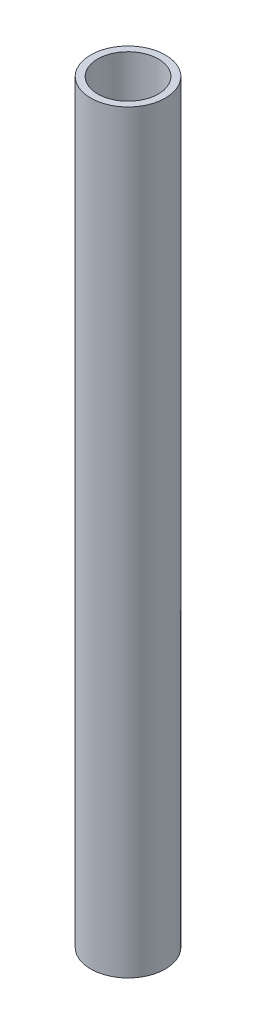
ISO-10303-21;
HEADER;
FILE_DESCRIPTION(('STEP AP214'),'2;1');
FILE_NAME('part.step','',(''),(''),'','','');
FILE_SCHEMA(('AUTOMOTIVE_DESIGN { 1 0 10303 214 1 1 1 1 }'));
ENDSEC;
DATA;
#1=APPLICATION_CONTEXT('core data for automotive mechanical design processes');
#2=APPLICATION_PROTOCOL_DEFINITION('international standard','automotive_design',2000,#1);
#3=PRODUCT_CONTEXT('',#1,'mechanical');
#4=PRODUCT('Part','Part','',(#3));
#5=PRODUCT_RELATED_PRODUCT_CATEGORY('part','',(#4));
#6=PRODUCT_DEFINITION_FORMATION('','',#4);
#7=PRODUCT_DEFINITION_CONTEXT('part definition',#1,'design');
#8=PRODUCT_DEFINITION('design','',#6,#7);
#9=PRODUCT_DEFINITION_SHAPE('','',#8);
#10=(LENGTH_UNIT() NAMED_UNIT(*) SI_UNIT(.MILLI.,.METRE.));
#11=(NAMED_UNIT(*) PLANE_ANGLE_UNIT() SI_UNIT($,.RADIAN.));
#12=(NAMED_UNIT(*) SI_UNIT($,.STERADIAN.) SOLID_ANGLE_UNIT());
#13=UNCERTAINTY_MEASURE_WITH_UNIT(LENGTH_MEASURE(1.E-05),#10,'distance_accuracy_value','');
#14=(GEOMETRIC_REPRESENTATION_CONTEXT(3) GLOBAL_UNCERTAINTY_ASSIGNED_CONTEXT((#13)) GLOBAL_UNIT_ASSIGNED_CONTEXT((#10,
#11,#12)) REPRESENTATION_CONTEXT('',''));
#15=CARTESIAN_POINT('',(0.,0.,0.));
#16=DIRECTION('',(0.,0.,1.));
#17=DIRECTION('',(1.,0.,0.));
#18=AXIS2_PLACEMENT_3D('',#15,#16,#17);
#19=CARTESIAN_POINT('',(0.,215.,1.50000000000001));
#20=DIRECTION('',(0.,1.,0.));
#21=DIRECTION('',(0.,0.,1.));
#22=AXIS2_PLACEMENT_3D('',#19,#20,#21);
#23=PLANE('',#22);
#24=CARTESIAN_POINT('',(0.,215.,1.50000000000001));
#25=DIRECTION('',(0.,1.,0.));
#26=DIRECTION('',(0.,0.,1.));
#27=AXIS2_PLACEMENT_3D('',#24,#25,#26);
#28=CIRCLE('',#27,10.65);
#29=CARTESIAN_POINT('',(0.,215.,-9.14999999999999));
#30=VERTEX_POINT('',#29);
#31=EDGE_CURVE('E10',#30,#30,#28,.T.);
#32=ORIENTED_EDGE('',*,*,#31,.T.);
#33=EDGE_LOOP('',(#32));
#34=FACE_BOUND('',#33,.T.);
#35=CARTESIAN_POINT('',(0.,215.,1.50000000000001));
#36=DIRECTION('',(0.,1.,0.));
#37=DIRECTION('',(0.,0.,1.));
#38=AXIS2_PLACEMENT_3D('',#35,#36,#37);
#39=CIRCLE('',#38,8.65);
#40=CARTESIAN_POINT('',(0.,215.,-7.14999999999999));
#41=VERTEX_POINT('',#40);
#42=EDGE_CURVE('E41',#41,#41,#39,.T.);
#43=ORIENTED_EDGE('',*,*,#42,.F.);
#44=EDGE_LOOP('',(#43));
#45=FACE_BOUND('',#44,.T.);
#46=ADVANCED_FACE('F30',(#34,#45),#23,.T.);
#47=CARTESIAN_POINT('',(0.,0.,1.50000000000001));
#48=DIRECTION('',(0.,1.,0.));
#49=DIRECTION('',(0.,0.,1.));
#50=AXIS2_PLACEMENT_3D('',#47,#48,#49);
#51=PLANE('',#50);
#52=CARTESIAN_POINT('',(0.,0.,1.50000000000001));
#53=DIRECTION('',(0.,1.,0.));
#54=DIRECTION('',(0.,0.,1.));
#55=AXIS2_PLACEMENT_3D('',#52,#53,#54);
#56=CIRCLE('',#55,10.65);
#57=CARTESIAN_POINT('',(0.,0.,-9.14999999999999));
#58=VERTEX_POINT('',#57);
#59=EDGE_CURVE('E34',#58,#58,#56,.T.);
#60=ORIENTED_EDGE('',*,*,#59,.F.);
#61=EDGE_LOOP('',(#60));
#62=FACE_BOUND('',#61,.T.);
#63=CARTESIAN_POINT('',(0.,0.,1.50000000000001));
#64=DIRECTION('',(0.,1.,0.));
#65=DIRECTION('',(0.,0.,1.));
#66=AXIS2_PLACEMENT_3D('',#63,#64,#65);
#67=CIRCLE('',#66,8.65);
#68=CARTESIAN_POINT('',(0.,0.,-7.14999999999999));
#69=VERTEX_POINT('',#68);
#70=EDGE_CURVE('E43',#69,#69,#67,.T.);
#71=ORIENTED_EDGE('',*,*,#70,.T.);
#72=EDGE_LOOP('',(#71));
#73=FACE_BOUND('',#72,.T.);
#74=ADVANCED_FACE('F53',(#62,#73),#51,.F.);
#75=CARTESIAN_POINT('',(0.,215.,1.50000000000001));
#76=DIRECTION('',(0.,-1.,0.));
#77=DIRECTION('',(0.,0.,-1.));
#78=AXIS2_PLACEMENT_3D('',#75,#76,#77);
#79=CYLINDRICAL_SURFACE('',#78,10.65);
#80=CARTESIAN_POINT('',(0.,215.,-9.14999999999999));
#81=CARTESIAN_POINT('',(0.,212.760416666667,-9.14999999999999));
#82=CARTESIAN_POINT('',(0.,210.520833333333,-9.14999999999999));
#83=CARTESIAN_POINT('',(0.,206.041666666667,-9.14999999999999));
#84=CARTESIAN_POINT('',(0.,203.802083333333,-9.14999999999999));
#85=CARTESIAN_POINT('',(0.,199.322916666667,-9.14999999999999));
#86=CARTESIAN_POINT('',(0.,197.083333333333,-9.14999999999999));
#87=CARTESIAN_POINT('',(0.,192.604166666667,-9.14999999999999));
#88=CARTESIAN_POINT('',(0.,190.364583333333,-9.14999999999999));
#89=CARTESIAN_POINT('',(0.,185.885416666667,-9.14999999999999));
#90=CARTESIAN_POINT('',(0.,183.645833333333,-9.14999999999999));
#91=CARTESIAN_POINT('',(0.,179.166666666667,-9.14999999999999));
#92=CARTESIAN_POINT('',(0.,176.927083333333,-9.14999999999999));
#93=CARTESIAN_POINT('',(0.,172.447916666667,-9.14999999999999));
#94=CARTESIAN_POINT('',(0.,170.208333333333,-9.14999999999999));
#95=CARTESIAN_POINT('',(0.,165.729166666667,-9.14999999999999));
#96=CARTESIAN_POINT('',(0.,163.489583333333,-9.14999999999999));
#97=CARTESIAN_POINT('',(0.,159.010416666667,-9.14999999999999));
#98=CARTESIAN_POINT('',(0.,156.770833333333,-9.14999999999999));
#99=CARTESIAN_POINT('',(0.,152.291666666667,-9.14999999999999));
#100=CARTESIAN_POINT('',(0.,150.052083333333,-9.14999999999999));
#101=CARTESIAN_POINT('',(0.,145.572916666667,-9.14999999999999));
#102=CARTESIAN_POINT('',(0.,143.333333333333,-9.14999999999999));
#103=CARTESIAN_POINT('',(0.,138.854166666667,-9.14999999999999));
#104=CARTESIAN_POINT('',(0.,136.614583333333,-9.14999999999999));
#105=CARTESIAN_POINT('',(0.,132.135416666667,-9.14999999999999));
#106=CARTESIAN_POINT('',(0.,129.895833333333,-9.14999999999999));
#107=CARTESIAN_POINT('',(0.,125.416666666667,-9.14999999999999));
#108=CARTESIAN_POINT('',(0.,123.177083333333,-9.14999999999999));
#109=CARTESIAN_POINT('',(0.,118.697916666667,-9.14999999999999));
#110=CARTESIAN_POINT('',(0.,116.458333333333,-9.14999999999999));
#111=CARTESIAN_POINT('',(0.,111.979166666667,-9.14999999999999));
#112=CARTESIAN_POINT('',(0.,109.739583333333,-9.14999999999999));
#113=CARTESIAN_POINT('',(0.,105.260416666667,-9.14999999999999));
#114=CARTESIAN_POINT('',(0.,103.020833333333,-9.14999999999999));
#115=CARTESIAN_POINT('',(0.,98.5416666666666,-9.14999999999999));
#116=CARTESIAN_POINT('',(0.,96.3020833333333,-9.14999999999999));
#117=CARTESIAN_POINT('',(0.,91.8229166666666,-9.14999999999999));
#118=CARTESIAN_POINT('',(0.,89.5833333333333,-9.14999999999999));
#119=CARTESIAN_POINT('',(0.,85.1041666666666,-9.14999999999999));
#120=CARTESIAN_POINT('',(0.,82.8645833333333,-9.14999999999999));
#121=CARTESIAN_POINT('',(0.,78.3854166666666,-9.14999999999999));
#122=CARTESIAN_POINT('',(0.,76.1458333333333,-9.14999999999999));
#123=CARTESIAN_POINT('',(0.,71.6666666666666,-9.14999999999999));
#124=CARTESIAN_POINT('',(0.,69.4270833333333,-9.14999999999999));
#125=CARTESIAN_POINT('',(0.,64.9479166666666,-9.14999999999999));
#126=CARTESIAN_POINT('',(0.,62.7083333333333,-9.14999999999999));
#127=CARTESIAN_POINT('',(0.,58.2291666666667,-9.14999999999999));
#128=CARTESIAN_POINT('',(0.,55.9895833333333,-9.14999999999999));
#129=CARTESIAN_POINT('',(0.,51.5104166666667,-9.14999999999999));
#130=CARTESIAN_POINT('',(0.,49.2708333333333,-9.14999999999999));
#131=CARTESIAN_POINT('',(0.,44.7916666666666,-9.14999999999999));
#132=CARTESIAN_POINT('',(0.,42.5520833333333,-9.14999999999999));
#133=CARTESIAN_POINT('',(0.,38.0729166666666,-9.14999999999999));
#134=CARTESIAN_POINT('',(0.,35.8333333333333,-9.14999999999999));
#135=CARTESIAN_POINT('',(0.,31.3541666666666,-9.14999999999999));
#136=CARTESIAN_POINT('',(0.,29.1145833333333,-9.14999999999999));
#137=CARTESIAN_POINT('',(0.,24.6354166666667,-9.14999999999999));
#138=CARTESIAN_POINT('',(0.,22.3958333333333,-9.14999999999999));
#139=CARTESIAN_POINT('',(0.,17.9166666666666,-9.14999999999999));
#140=CARTESIAN_POINT('',(0.,15.6770833333333,-9.14999999999999));
#141=CARTESIAN_POINT('',(0.,11.1979166666666,-9.14999999999999));
#142=CARTESIAN_POINT('',(0.,8.9583333333333,-9.14999999999999));
#143=CARTESIAN_POINT('',(0.,4.47916666666664,-9.14999999999999));
#144=CARTESIAN_POINT('',(0.,2.23958333333331,-9.14999999999999));
#145=CARTESIAN_POINT('',(0.,0.,-9.14999999999999));
#146=B_SPLINE_CURVE_WITH_KNOTS('',3,(#80,#81,#82,#83,#84,#85,#86,#87,#88,#89,#90,#91,#92,#93,
#94,#95,#96,#97,#98,#99,#100,#101,#102,#103,#104,#105,#106,#107,#108,#109,#110,#111,#112,#113,
#114,#115,#116,#117,#118,#119,#120,#121,#122,#123,#124,#125,#126,#127,#128,#129,#130,#131,#132,
#133,#134,#135,#136,#137,#138,#139,#140,#141,#142,#143,#144,#145),.UNSPECIFIED.,.F.,.F.,(4,2,2,
2,2,2,2,2,2,2,2,2,2,2,2,2,2,2,2,2,2,2,2,2,2,2,2,2,2,2,2,2,4),(0.,6.71875000000002,13.4375,
20.15625,26.875,33.59375,40.3125,47.03125,53.75,60.46875,67.1875,73.90625,80.625,87.34375,
94.0625,100.78125,107.5,114.21875,120.9375,127.65625,134.375,141.09375,147.8125,154.53125,
161.25,167.96875,174.6875,181.40625,188.125,194.84375,201.5625,208.28125,215.),.UNSPECIFIED.);
#147=EDGE_CURVE('BSEAM32',#30,#58,#146,.T.);
#148=ORIENTED_EDGE('',*,*,#31,.F.);
#149=ORIENTED_EDGE('',*,*,#59,.T.);
#150=ORIENTED_EDGE('',*,*,#147,.T.);
#151=ORIENTED_EDGE('',*,*,#147,.F.);
#152=EDGE_LOOP('',(#148,#150,#149,#151));
#153=FACE_BOUND('',#152,.T.);
#154=ADVANCED_FACE('F32',(#153),#79,.T.);
#155=CARTESIAN_POINT('',(0.,215.,1.50000000000001));
#156=DIRECTION('',(0.,-1.,0.));
#157=DIRECTION('',(0.,0.,-1.));
#158=AXIS2_PLACEMENT_3D('',#155,#156,#157);
#159=CYLINDRICAL_SURFACE('',#158,8.65);
#160=CARTESIAN_POINT('',(0.,215.,-7.14999999999999));
#161=CARTESIAN_POINT('',(0.,212.760416666667,-7.14999999999999));
#162=CARTESIAN_POINT('',(0.,210.520833333333,-7.14999999999999));
#163=CARTESIAN_POINT('',(0.,206.041666666667,-7.14999999999999));
#164=CARTESIAN_POINT('',(0.,203.802083333333,-7.14999999999999));
#165=CARTESIAN_POINT('',(0.,199.322916666667,-7.14999999999999));
#166=CARTESIAN_POINT('',(0.,197.083333333333,-7.14999999999999));
#167=CARTESIAN_POINT('',(0.,192.604166666667,-7.14999999999999));
#168=CARTESIAN_POINT('',(0.,190.364583333333,-7.14999999999999));
#169=CARTESIAN_POINT('',(0.,185.885416666667,-7.14999999999999));
#170=CARTESIAN_POINT('',(0.,183.645833333333,-7.14999999999999));
#171=CARTESIAN_POINT('',(0.,179.166666666667,-7.14999999999999));
#172=CARTESIAN_POINT('',(0.,176.927083333333,-7.14999999999999));
#173=CARTESIAN_POINT('',(0.,172.447916666667,-7.14999999999999));
#174=CARTESIAN_POINT('',(0.,170.208333333333,-7.14999999999999));
#175=CARTESIAN_POINT('',(0.,165.729166666667,-7.14999999999999));
#176=CARTESIAN_POINT('',(0.,163.489583333333,-7.14999999999999));
#177=CARTESIAN_POINT('',(0.,159.010416666667,-7.14999999999999));
#178=CARTESIAN_POINT('',(0.,156.770833333333,-7.14999999999999));
#179=CARTESIAN_POINT('',(0.,152.291666666667,-7.14999999999999));
#180=CARTESIAN_POINT('',(0.,150.052083333333,-7.14999999999999));
#181=CARTESIAN_POINT('',(0.,145.572916666667,-7.14999999999999));
#182=CARTESIAN_POINT('',(0.,143.333333333333,-7.14999999999999));
#183=CARTESIAN_POINT('',(0.,138.854166666667,-7.14999999999999));
#184=CARTESIAN_POINT('',(0.,136.614583333333,-7.14999999999999));
#185=CARTESIAN_POINT('',(0.,132.135416666667,-7.14999999999999));
#186=CARTESIAN_POINT('',(0.,129.895833333333,-7.14999999999999));
#187=CARTESIAN_POINT('',(0.,125.416666666667,-7.14999999999999));
#188=CARTESIAN_POINT('',(0.,123.177083333333,-7.14999999999999));
#189=CARTESIAN_POINT('',(0.,118.697916666667,-7.14999999999999));
#190=CARTESIAN_POINT('',(0.,116.458333333333,-7.14999999999999));
#191=CARTESIAN_POINT('',(0.,111.979166666667,-7.14999999999999));
#192=CARTESIAN_POINT('',(0.,109.739583333333,-7.14999999999999));
#193=CARTESIAN_POINT('',(0.,105.260416666667,-7.14999999999999));
#194=CARTESIAN_POINT('',(0.,103.020833333333,-7.14999999999999));
#195=CARTESIAN_POINT('',(0.,98.5416666666666,-7.14999999999999));
#196=CARTESIAN_POINT('',(0.,96.3020833333333,-7.14999999999999));
#197=CARTESIAN_POINT('',(0.,91.8229166666666,-7.14999999999999));
#198=CARTESIAN_POINT('',(0.,89.5833333333333,-7.14999999999999));
#199=CARTESIAN_POINT('',(0.,85.1041666666666,-7.14999999999999));
#200=CARTESIAN_POINT('',(0.,82.8645833333333,-7.14999999999999));
#201=CARTESIAN_POINT('',(0.,78.3854166666666,-7.14999999999999));
#202=CARTESIAN_POINT('',(0.,76.1458333333333,-7.14999999999999));
#203=CARTESIAN_POINT('',(0.,71.6666666666666,-7.14999999999999));
#204=CARTESIAN_POINT('',(0.,69.4270833333333,-7.14999999999999));
#205=CARTESIAN_POINT('',(0.,64.9479166666666,-7.14999999999999));
#206=CARTESIAN_POINT('',(0.,62.7083333333333,-7.14999999999999));
#207=CARTESIAN_POINT('',(0.,58.2291666666667,-7.14999999999999));
#208=CARTESIAN_POINT('',(0.,55.9895833333333,-7.14999999999999));
#209=CARTESIAN_POINT('',(0.,51.5104166666667,-7.14999999999999));
#210=CARTESIAN_POINT('',(0.,49.2708333333333,-7.14999999999999));
#211=CARTESIAN_POINT('',(0.,44.7916666666666,-7.14999999999999));
#212=CARTESIAN_POINT('',(0.,42.5520833333333,-7.14999999999999));
#213=CARTESIAN_POINT('',(0.,38.0729166666666,-7.14999999999999));
#214=CARTESIAN_POINT('',(0.,35.8333333333333,-7.14999999999999));
#215=CARTESIAN_POINT('',(0.,31.3541666666666,-7.14999999999999));
#216=CARTESIAN_POINT('',(0.,29.1145833333333,-7.14999999999999));
#217=CARTESIAN_POINT('',(0.,24.6354166666667,-7.14999999999999));
#218=CARTESIAN_POINT('',(0.,22.3958333333333,-7.14999999999999));
#219=CARTESIAN_POINT('',(0.,17.9166666666666,-7.14999999999999));
#220=CARTESIAN_POINT('',(0.,15.6770833333333,-7.14999999999999));
#221=CARTESIAN_POINT('',(0.,11.1979166666666,-7.14999999999999));
#222=CARTESIAN_POINT('',(0.,8.9583333333333,-7.14999999999999));
#223=CARTESIAN_POINT('',(0.,4.47916666666664,-7.14999999999999));
#224=CARTESIAN_POINT('',(0.,2.23958333333331,-7.14999999999999));
#225=CARTESIAN_POINT('',(0.,0.,-7.14999999999999));
#226=B_SPLINE_CURVE_WITH_KNOTS('',3,(#160,#161,#162,#163,#164,#165,#166,#167,#168,#169,#170,
#171,#172,#173,#174,#175,#176,#177,#178,#179,#180,#181,#182,#183,#184,#185,#186,#187,#188,#189,
#190,#191,#192,#193,#194,#195,#196,#197,#198,#199,#200,#201,#202,#203,#204,#205,#206,#207,#208,
#209,#210,#211,#212,#213,#214,#215,#216,#217,#218,#219,#220,#221,#222,#223,#224,#225),
.UNSPECIFIED.,.F.,.F.,(4,2,2,2,2,2,2,2,2,2,2,2,2,2,2,2,2,2,2,2,2,2,2,2,2,2,2,2,2,2,2,2,4),(0.,
6.71875000000002,13.4375,20.15625,26.875,33.59375,40.3125,47.03125,53.75,60.46875,67.1875,
73.90625,80.625,87.34375,94.0625,100.78125,107.5,114.21875,120.9375,127.65625,134.375,141.09375,
147.8125,154.53125,161.25,167.96875,174.6875,181.40625,188.125,194.84375,201.5625,208.28125,
215.),.UNSPECIFIED.);
#227=EDGE_CURVE('BSEAM49',#41,#69,#226,.T.);
#228=ORIENTED_EDGE('',*,*,#42,.T.);
#229=ORIENTED_EDGE('',*,*,#70,.F.);
#230=ORIENTED_EDGE('',*,*,#227,.T.);
#231=ORIENTED_EDGE('',*,*,#227,.F.);
#232=EDGE_LOOP('',(#228,#230,#229,#231));
#233=FACE_BOUND('',#232,.T.);
#234=ADVANCED_FACE('F49',(#233),#159,.F.);
#235=CLOSED_SHELL('',(#46,#74,#154,#234));
#236=MANIFOLD_SOLID_BREP('B2',#235);
#237=ADVANCED_BREP_SHAPE_REPRESENTATION('',(#18,#236),#14);
#238=SHAPE_DEFINITION_REPRESENTATION(#9,#237);
ENDSEC;
END-ISO-10303-21;
